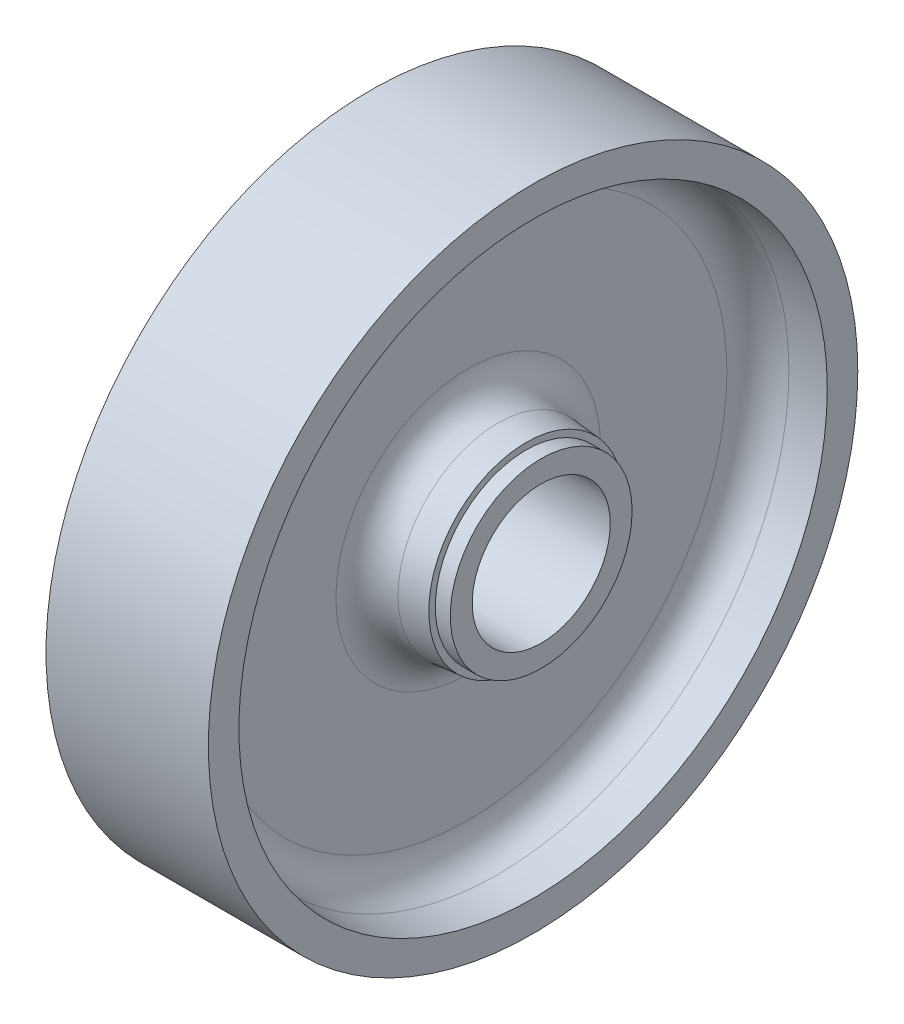
ISO-10303-21;
HEADER;
FILE_DESCRIPTION(('STEP AP214'),'2;1');
FILE_NAME('part.step','',(''),(''),'','','');
FILE_SCHEMA(('AUTOMOTIVE_DESIGN { 1 0 10303 214 1 1 1 1 }'));
ENDSEC;
DATA;
#1=APPLICATION_CONTEXT('core data for automotive mechanical design processes');
#2=APPLICATION_PROTOCOL_DEFINITION('international standard','automotive_design',2000,#1);
#3=PRODUCT_CONTEXT('',#1,'mechanical');
#4=PRODUCT('Part','Part','',(#3));
#5=PRODUCT_RELATED_PRODUCT_CATEGORY('part','',(#4));
#6=PRODUCT_DEFINITION_FORMATION('','',#4);
#7=PRODUCT_DEFINITION_CONTEXT('part definition',#1,'design');
#8=PRODUCT_DEFINITION('design','',#6,#7);
#9=PRODUCT_DEFINITION_SHAPE('','',#8);
#10=(LENGTH_UNIT() NAMED_UNIT(*) SI_UNIT(.MILLI.,.METRE.));
#11=(NAMED_UNIT(*) PLANE_ANGLE_UNIT() SI_UNIT($,.RADIAN.));
#12=(NAMED_UNIT(*) SI_UNIT($,.STERADIAN.) SOLID_ANGLE_UNIT());
#13=UNCERTAINTY_MEASURE_WITH_UNIT(LENGTH_MEASURE(1.E-05),#10,'distance_accuracy_value','');
#14=(GEOMETRIC_REPRESENTATION_CONTEXT(3) GLOBAL_UNCERTAINTY_ASSIGNED_CONTEXT((#13)) GLOBAL_UNIT_ASSIGNED_CONTEXT((#10,
#11,#12)) REPRESENTATION_CONTEXT('',''));
#15=CARTESIAN_POINT('',(0.,0.,0.));
#16=DIRECTION('',(0.,0.,1.));
#17=DIRECTION('',(1.,0.,0.));
#18=AXIS2_PLACEMENT_3D('',#15,#16,#17);
#19=CARTESIAN_POINT('',(-14.5288000000009,19.049999999999,0.));
#20=DIRECTION('',(-1.,0.,0.));
#21=DIRECTION('',(0.,0.,1.));
#22=AXIS2_PLACEMENT_3D('',#19,#20,#21);
#23=PLANE('',#22);
#24=CARTESIAN_POINT('',(-14.5288000000009,0.,0.));
#25=DIRECTION('',(1.,0.,0.));
#26=DIRECTION('',(0.,0.,-1.));
#27=AXIS2_PLACEMENT_3D('',#24,#25,#26);
#28=CIRCLE('',#27,17.779999999999);
#29=CARTESIAN_POINT('',(-14.5288000000009,0.,-17.779999999999));
#30=VERTEX_POINT('',#29);
#31=EDGE_CURVE('E100',#30,#30,#28,.T.);
#32=ORIENTED_EDGE('',*,*,#31,.T.);
#33=EDGE_LOOP('',(#32));
#34=FACE_BOUND('',#33,.T.);
#35=CARTESIAN_POINT('',(-14.5288000000009,0.,0.));
#36=DIRECTION('',(1.,0.,0.));
#37=DIRECTION('',(0.,0.,-1.));
#38=AXIS2_PLACEMENT_3D('',#35,#36,#37);
#39=CIRCLE('',#38,19.049999999999);
#40=CARTESIAN_POINT('',(-14.5288000000009,0.,-19.049999999999));
#41=VERTEX_POINT('',#40);
#42=EDGE_CURVE('E10',#41,#41,#39,.T.);
#43=ORIENTED_EDGE('',*,*,#42,.F.);
#44=EDGE_LOOP('',(#43));
#45=FACE_BOUND('',#44,.T.);
#46=ADVANCED_FACE('F36',(#34,#45),#23,.T.);
#47=CARTESIAN_POINT('',(-8.97156103355268,0.,0.));
#48=DIRECTION('',(1.,0.,0.));
#49=DIRECTION('',(0.,0.,-1.));
#50=AXIS2_PLACEMENT_3D('',#47,#48,#49);
#51=CONICAL_SURFACE('',#50,19.536195410068,0.0872664625997704);
#52=ORIENTED_EDGE('',*,*,#42,.T.);
#53=EDGE_LOOP('',(#52));
#54=FACE_BOUND('',#53,.T.);
#55=CARTESIAN_POINT('',(-8.97156103355268,0.,0.));
#56=DIRECTION('',(1.,0.,0.));
#57=DIRECTION('',(0.,0.,-1.));
#58=AXIS2_PLACEMENT_3D('',#55,#56,#57);
#59=CIRCLE('',#58,19.536195410068);
#60=CARTESIAN_POINT('',(-8.97156103355268,0.,-19.536195410068));
#61=VERTEX_POINT('',#60);
#62=EDGE_CURVE('E42',#61,#61,#59,.T.);
#63=ORIENTED_EDGE('',*,*,#62,.F.);
#64=EDGE_LOOP('',(#63));
#65=FACE_BOUND('',#64,.T.);
#66=ADVANCED_FACE('F118',(#54,#65),#51,.T.);
#67=CARTESIAN_POINT('',(-9.52500000000071,0.,0.));
#68=DIRECTION('',(1.,0.,0.));
#69=DIRECTION('',(0.,0.,-1.));
#70=AXIS2_PLACEMENT_3D('',#67,#68,#69);
#71=TOROIDAL_SURFACE('',#70,25.8620317429513,6.35000000000071);
#72=ORIENTED_EDGE('',*,*,#62,.T.);
#73=EDGE_LOOP('',(#72));
#74=FACE_BOUND('',#73,.T.);
#75=CARTESIAN_POINT('',(-3.175,0.,0.));
#76=DIRECTION('',(1.,0.,0.));
#77=DIRECTION('',(0.,0.,-1.));
#78=AXIS2_PLACEMENT_3D('',#75,#76,#77);
#79=CIRCLE('',#78,25.8620317429513);
#80=CARTESIAN_POINT('',(-3.175,0.,-25.8620317429513));
#81=VERTEX_POINT('',#80);
#82=EDGE_CURVE('E46',#81,#81,#79,.T.);
#83=ORIENTED_EDGE('',*,*,#82,.F.);
#84=EDGE_LOOP('',(#83));
#85=FACE_BOUND('',#84,.T.);
#86=ADVANCED_FACE('F122',(#74,#85),#71,.F.);
#87=CARTESIAN_POINT('',(-3.17500000000001,50.6011910182107,0.));
#88=DIRECTION('',(-1.,0.,0.));
#89=DIRECTION('',(0.,0.,1.));
#90=AXIS2_PLACEMENT_3D('',#87,#88,#89);
#91=PLANE('',#90);
#92=ORIENTED_EDGE('',*,*,#82,.T.);
#93=EDGE_LOOP('',(#92));
#94=FACE_BOUND('',#93,.T.);
#95=CARTESIAN_POINT('',(-3.17500000000001,0.,0.));
#96=DIRECTION('',(1.,0.,0.));
#97=DIRECTION('',(0.,0.,-1.));
#98=AXIS2_PLACEMENT_3D('',#95,#96,#97);
#99=CIRCLE('',#98,50.6011910182107);
#100=CARTESIAN_POINT('',(-3.17500000000001,0.,-50.6011910182107));
#101=VERTEX_POINT('',#100);
#102=EDGE_CURVE('E50',#101,#101,#99,.T.);
#103=ORIENTED_EDGE('',*,*,#102,.F.);
#104=EDGE_LOOP('',(#103));
#105=FACE_BOUND('',#104,.T.);
#106=ADVANCED_FACE('F126',(#94,#105),#91,.T.);
#107=CARTESIAN_POINT('',(-9.52499999999971,0.,0.));
#108=DIRECTION('',(1.,0.,0.));
#109=DIRECTION('',(0.,0.,-1.));
#110=AXIS2_PLACEMENT_3D('',#107,#108,#109);
#111=TOROIDAL_SURFACE('',#110,50.6011910182107,6.3499999999997);
#112=ORIENTED_EDGE('',*,*,#102,.T.);
#113=EDGE_LOOP('',(#112));
#114=FACE_BOUND('',#113,.T.);
#115=CARTESIAN_POINT('',(-8.9715610335524,0.,0.));
#116=DIRECTION('',(1.,0.,0.));
#117=DIRECTION('',(0.,0.,-1.));
#118=AXIS2_PLACEMENT_3D('',#115,#116,#117);
#119=CIRCLE('',#118,56.927027351093);
#120=CARTESIAN_POINT('',(-8.9715610335524,0.,-56.927027351093));
#121=VERTEX_POINT('',#120);
#122=EDGE_CURVE('E55',#121,#121,#119,.T.);
#123=ORIENTED_EDGE('',*,*,#122,.F.);
#124=EDGE_LOOP('',(#123));
#125=FACE_BOUND('',#124,.T.);
#126=ADVANCED_FACE('F132',(#114,#125),#111,.F.);
#127=CARTESIAN_POINT('',(-15.875,0.,0.));
#128=DIRECTION('',(-1.,0.,0.));
#129=DIRECTION('',(0.,0.,1.));
#130=AXIS2_PLACEMENT_3D('',#127,#128,#129);
#131=CONICAL_SURFACE('',#130,57.531,0.0872664625996731);
#132=ORIENTED_EDGE('',*,*,#122,.T.);
#133=EDGE_LOOP('',(#132));
#134=FACE_BOUND('',#133,.T.);
#135=CARTESIAN_POINT('',(-15.875,0.,0.));
#136=DIRECTION('',(1.,0.,0.));
#137=DIRECTION('',(0.,0.,-1.));
#138=AXIS2_PLACEMENT_3D('',#135,#136,#137);
#139=CIRCLE('',#138,57.531);
#140=CARTESIAN_POINT('',(-15.875,0.,-57.531));
#141=VERTEX_POINT('',#140);
#142=EDGE_CURVE('E58',#141,#141,#139,.T.);
#143=ORIENTED_EDGE('',*,*,#142,.F.);
#144=EDGE_LOOP('',(#143));
#145=FACE_BOUND('',#144,.T.);
#146=ADVANCED_FACE('F136',(#134,#145),#131,.F.);
#147=CARTESIAN_POINT('',(-15.875,63.5,0.));
#148=DIRECTION('',(-1.,0.,0.));
#149=DIRECTION('',(0.,0.,1.));
#150=AXIS2_PLACEMENT_3D('',#147,#148,#149);
#151=PLANE('',#150);
#152=ORIENTED_EDGE('',*,*,#142,.T.);
#153=EDGE_LOOP('',(#152));
#154=FACE_BOUND('',#153,.T.);
#155=CARTESIAN_POINT('',(-15.875,0.,0.));
#156=DIRECTION('',(1.,0.,0.));
#157=DIRECTION('',(0.,0.,-1.));
#158=AXIS2_PLACEMENT_3D('',#155,#156,#157);
#159=CIRCLE('',#158,63.5);
#160=CARTESIAN_POINT('',(-15.875,0.,-63.5));
#161=VERTEX_POINT('',#160);
#162=EDGE_CURVE('E61',#161,#161,#159,.T.);
#163=ORIENTED_EDGE('',*,*,#162,.F.);
#164=EDGE_LOOP('',(#163));
#165=FACE_BOUND('',#164,.T.);
#166=ADVANCED_FACE('F140',(#154,#165),#151,.T.);
#167=CARTESIAN_POINT('',(-17.4625,0.,0.));
#168=DIRECTION('',(1.,0.,0.));
#169=DIRECTION('',(0.,0.,-1.));
#170=AXIS2_PLACEMENT_3D('',#167,#168,#169);
#171=CYLINDRICAL_SURFACE('',#170,63.5);
#172=ORIENTED_EDGE('',*,*,#162,.T.);
#173=EDGE_LOOP('',(#172));
#174=FACE_BOUND('',#173,.T.);
#175=CARTESIAN_POINT('',(15.8750000000026,0.,0.));
#176=DIRECTION('',(1.,0.,0.));
#177=DIRECTION('',(0.,0.,-1.));
#178=AXIS2_PLACEMENT_3D('',#175,#176,#177);
#179=CIRCLE('',#178,63.5);
#180=CARTESIAN_POINT('',(15.8750000000026,0.,-63.5));
#181=VERTEX_POINT('',#180);
#182=EDGE_CURVE('E64',#181,#181,#179,.T.);
#183=ORIENTED_EDGE('',*,*,#182,.F.);
#184=EDGE_LOOP('',(#183));
#185=FACE_BOUND('',#184,.T.);
#186=ADVANCED_FACE('F144',(#174,#185),#171,.T.);
#187=CARTESIAN_POINT('',(15.8750000000026,57.5310000000028,0.));
#188=DIRECTION('',(1.,0.,0.));
#189=DIRECTION('',(0.,0.,-1.));
#190=AXIS2_PLACEMENT_3D('',#187,#188,#189);
#191=PLANE('',#190);
#192=ORIENTED_EDGE('',*,*,#182,.T.);
#193=EDGE_LOOP('',(#192));
#194=FACE_BOUND('',#193,.T.);
#195=CARTESIAN_POINT('',(15.8750000000026,0.,0.));
#196=DIRECTION('',(1.,0.,0.));
#197=DIRECTION('',(0.,0.,-1.));
#198=AXIS2_PLACEMENT_3D('',#195,#196,#197);
#199=CIRCLE('',#198,57.5310000000028);
#200=CARTESIAN_POINT('',(15.8750000000026,0.,-57.5310000000028));
#201=VERTEX_POINT('',#200);
#202=EDGE_CURVE('E67',#201,#201,#199,.T.);
#203=ORIENTED_EDGE('',*,*,#202,.F.);
#204=EDGE_LOOP('',(#203));
#205=FACE_BOUND('',#204,.T.);
#206=ADVANCED_FACE('F148',(#194,#205),#191,.T.);
#207=CARTESIAN_POINT('',(8.97156103355497,0.,0.));
#208=DIRECTION('',(1.,0.,0.));
#209=DIRECTION('',(0.,0.,-1.));
#210=AXIS2_PLACEMENT_3D('',#207,#208,#209);
#211=CONICAL_SURFACE('',#210,56.9270273510959,0.0872664625996738);
#212=ORIENTED_EDGE('',*,*,#202,.T.);
#213=EDGE_LOOP('',(#212));
#214=FACE_BOUND('',#213,.T.);
#215=CARTESIAN_POINT('',(8.97156103355497,0.,0.));
#216=DIRECTION('',(1.,0.,0.));
#217=DIRECTION('',(0.,0.,-1.));
#218=AXIS2_PLACEMENT_3D('',#215,#216,#217);
#219=CIRCLE('',#218,56.9270273510959);
#220=CARTESIAN_POINT('',(8.97156103355497,0.,-56.9270273510959));
#221=VERTEX_POINT('',#220);
#222=EDGE_CURVE('E70',#221,#221,#219,.T.);
#223=ORIENTED_EDGE('',*,*,#222,.F.);
#224=EDGE_LOOP('',(#223));
#225=FACE_BOUND('',#224,.T.);
#226=ADVANCED_FACE('F152',(#214,#225),#211,.F.);
#227=CARTESIAN_POINT('',(9.52500000000264,0.,0.));
#228=DIRECTION('',(1.,0.,0.));
#229=DIRECTION('',(0.,0.,-1.));
#230=AXIS2_PLACEMENT_3D('',#227,#228,#229);
#231=TOROIDAL_SURFACE('',#230,50.6011910182097,6.35000000000357);
#232=ORIENTED_EDGE('',*,*,#222,.T.);
#233=EDGE_LOOP('',(#232));
#234=FACE_BOUND('',#233,.T.);
#235=CARTESIAN_POINT('',(3.17499999999908,0.,0.));
#236=DIRECTION('',(1.,0.,0.));
#237=DIRECTION('',(0.,0.,-1.));
#238=AXIS2_PLACEMENT_3D('',#235,#236,#237);
#239=CIRCLE('',#238,50.6011910182097);
#240=CARTESIAN_POINT('',(3.17499999999908,0.,-50.6011910182097));
#241=VERTEX_POINT('',#240);
#242=EDGE_CURVE('E73',#241,#241,#239,.T.);
#243=ORIENTED_EDGE('',*,*,#242,.F.);
#244=EDGE_LOOP('',(#243));
#245=FACE_BOUND('',#244,.T.);
#246=ADVANCED_FACE('F156',(#234,#245),#231,.F.);
#247=CARTESIAN_POINT('',(3.17499999999908,25.8620317429503,0.));
#248=DIRECTION('',(1.,0.,0.));
#249=DIRECTION('',(0.,0.,-1.));
#250=AXIS2_PLACEMENT_3D('',#247,#248,#249);
#251=PLANE('',#250);
#252=ORIENTED_EDGE('',*,*,#242,.T.);
#253=EDGE_LOOP('',(#252));
#254=FACE_BOUND('',#253,.T.);
#255=CARTESIAN_POINT('',(3.17499999999908,0.,0.));
#256=DIRECTION('',(1.,0.,0.));
#257=DIRECTION('',(0.,0.,-1.));
#258=AXIS2_PLACEMENT_3D('',#255,#256,#257);
#259=CIRCLE('',#258,25.8620317429503);
#260=CARTESIAN_POINT('',(3.17499999999908,0.,-25.8620317429503));
#261=VERTEX_POINT('',#260);
#262=EDGE_CURVE('E76',#261,#261,#259,.T.);
#263=ORIENTED_EDGE('',*,*,#262,.F.);
#264=EDGE_LOOP('',(#263));
#265=FACE_BOUND('',#264,.T.);
#266=ADVANCED_FACE('F160',(#254,#265),#251,.T.);
#267=CARTESIAN_POINT('',(9.52499999999878,0.,0.));
#268=DIRECTION('',(1.,0.,0.));
#269=DIRECTION('',(0.,0.,-1.));
#270=AXIS2_PLACEMENT_3D('',#267,#268,#269);
#271=TOROIDAL_SURFACE('',#270,25.8620317429503,6.3499999999997);
#272=ORIENTED_EDGE('',*,*,#262,.T.);
#273=EDGE_LOOP('',(#272));
#274=FACE_BOUND('',#273,.T.);
#275=CARTESIAN_POINT('',(8.97156103355083,0.,0.));
#276=DIRECTION('',(1.,0.,0.));
#277=DIRECTION('',(0.,0.,-1.));
#278=AXIS2_PLACEMENT_3D('',#275,#276,#277);
#279=CIRCLE('',#278,19.536195410068);
#280=CARTESIAN_POINT('',(8.97156103355083,0.,-19.536195410068));
#281=VERTEX_POINT('',#280);
#282=EDGE_CURVE('E79',#281,#281,#279,.T.);
#283=ORIENTED_EDGE('',*,*,#282,.F.);
#284=EDGE_LOOP('',(#283));
#285=FACE_BOUND('',#284,.T.);
#286=ADVANCED_FACE('F164',(#274,#285),#271,.F.);
#287=CARTESIAN_POINT('',(14.5287999999991,0.,0.));
#288=DIRECTION('',(-1.,0.,0.));
#289=DIRECTION('',(0.,0.,1.));
#290=AXIS2_PLACEMENT_3D('',#287,#288,#289);
#291=CONICAL_SURFACE('',#290,19.049999999999,0.087266462599771);
#292=ORIENTED_EDGE('',*,*,#282,.T.);
#293=EDGE_LOOP('',(#292));
#294=FACE_BOUND('',#293,.T.);
#295=CARTESIAN_POINT('',(14.5287999999991,0.,0.));
#296=DIRECTION('',(1.,0.,0.));
#297=DIRECTION('',(0.,0.,-1.));
#298=AXIS2_PLACEMENT_3D('',#295,#296,#297);
#299=CIRCLE('',#298,19.049999999999);
#300=CARTESIAN_POINT('',(14.5287999999991,0.,-19.049999999999));
#301=VERTEX_POINT('',#300);
#302=EDGE_CURVE('E82',#301,#301,#299,.T.);
#303=ORIENTED_EDGE('',*,*,#302,.F.);
#304=EDGE_LOOP('',(#303));
#305=FACE_BOUND('',#304,.T.);
#306=ADVANCED_FACE('F168',(#294,#305),#291,.T.);
#307=CARTESIAN_POINT('',(14.5287999999991,17.779999999999,0.));
#308=DIRECTION('',(1.,0.,0.));
#309=DIRECTION('',(0.,0.,-1.));
#310=AXIS2_PLACEMENT_3D('',#307,#308,#309);
#311=PLANE('',#310);
#312=ORIENTED_EDGE('',*,*,#302,.T.);
#313=EDGE_LOOP('',(#312));
#314=FACE_BOUND('',#313,.T.);
#315=CARTESIAN_POINT('',(14.5287999999991,0.,0.));
#316=DIRECTION('',(1.,0.,0.));
#317=DIRECTION('',(0.,0.,-1.));
#318=AXIS2_PLACEMENT_3D('',#315,#316,#317);
#319=CIRCLE('',#318,17.779999999999);
#320=CARTESIAN_POINT('',(14.5287999999991,0.,-17.779999999999));
#321=VERTEX_POINT('',#320);
#322=EDGE_CURVE('E85',#321,#321,#319,.T.);
#323=ORIENTED_EDGE('',*,*,#322,.F.);
#324=EDGE_LOOP('',(#323));
#325=FACE_BOUND('',#324,.T.);
#326=ADVANCED_FACE('F172',(#314,#325),#311,.T.);
#327=CARTESIAN_POINT('',(-17.4625,0.,0.));
#328=DIRECTION('',(1.,0.,0.));
#329=DIRECTION('',(0.,0.,-1.));
#330=AXIS2_PLACEMENT_3D('',#327,#328,#329);
#331=CYLINDRICAL_SURFACE('',#330,17.779999999999);
#332=ORIENTED_EDGE('',*,*,#322,.T.);
#333=EDGE_LOOP('',(#332));
#334=FACE_BOUND('',#333,.T.);
#335=CARTESIAN_POINT('',(17.4624999999991,0.,0.));
#336=DIRECTION('',(1.,0.,0.));
#337=DIRECTION('',(0.,0.,-1.));
#338=AXIS2_PLACEMENT_3D('',#335,#336,#337);
#339=CIRCLE('',#338,17.779999999999);
#340=CARTESIAN_POINT('',(17.4624999999991,0.,-17.779999999999));
#341=VERTEX_POINT('',#340);
#342=EDGE_CURVE('E88',#341,#341,#339,.T.);
#343=ORIENTED_EDGE('',*,*,#342,.F.);
#344=EDGE_LOOP('',(#343));
#345=FACE_BOUND('',#344,.T.);
#346=ADVANCED_FACE('F176',(#334,#345),#331,.T.);
#347=CARTESIAN_POINT('',(17.4624999999991,13.500099999999,0.));
#348=DIRECTION('',(1.,0.,0.));
#349=DIRECTION('',(0.,0.,-1.));
#350=AXIS2_PLACEMENT_3D('',#347,#348,#349);
#351=PLANE('',#350);
#352=ORIENTED_EDGE('',*,*,#342,.T.);
#353=EDGE_LOOP('',(#352));
#354=FACE_BOUND('',#353,.T.);
#355=CARTESIAN_POINT('',(17.4624999999991,0.,0.));
#356=DIRECTION('',(1.,0.,0.));
#357=DIRECTION('',(0.,0.,-1.));
#358=AXIS2_PLACEMENT_3D('',#355,#356,#357);
#359=CIRCLE('',#358,13.500099999999);
#360=CARTESIAN_POINT('',(17.4624999999991,0.,-13.500099999999));
#361=VERTEX_POINT('',#360);
#362=EDGE_CURVE('E91',#361,#361,#359,.T.);
#363=ORIENTED_EDGE('',*,*,#362,.F.);
#364=EDGE_LOOP('',(#363));
#365=FACE_BOUND('',#364,.T.);
#366=ADVANCED_FACE('F180',(#354,#365),#351,.T.);
#367=CARTESIAN_POINT('',(-17.4625,0.,0.));
#368=DIRECTION('',(1.,0.,0.));
#369=DIRECTION('',(0.,0.,-1.));
#370=AXIS2_PLACEMENT_3D('',#367,#368,#369);
#371=CYLINDRICAL_SURFACE('',#370,13.500099999999);
#372=ORIENTED_EDGE('',*,*,#362,.T.);
#373=EDGE_LOOP('',(#372));
#374=FACE_BOUND('',#373,.T.);
#375=CARTESIAN_POINT('',(-17.4625000000009,0.,0.));
#376=DIRECTION('',(1.,0.,0.));
#377=DIRECTION('',(0.,0.,-1.));
#378=AXIS2_PLACEMENT_3D('',#375,#376,#377);
#379=CIRCLE('',#378,13.500099999999);
#380=CARTESIAN_POINT('',(-17.4625000000009,0.,-13.500099999999));
#381=VERTEX_POINT('',#380);
#382=EDGE_CURVE('E94',#381,#381,#379,.T.);
#383=ORIENTED_EDGE('',*,*,#382,.F.);
#384=EDGE_LOOP('',(#383));
#385=FACE_BOUND('',#384,.T.);
#386=ADVANCED_FACE('F114',(#374,#385),#371,.F.);
#387=CARTESIAN_POINT('',(-17.4625000000009,17.779999999999,0.));
#388=DIRECTION('',(-1.,0.,0.));
#389=DIRECTION('',(0.,0.,1.));
#390=AXIS2_PLACEMENT_3D('',#387,#388,#389);
#391=PLANE('',#390);
#392=ORIENTED_EDGE('',*,*,#382,.T.);
#393=EDGE_LOOP('',(#392));
#394=FACE_BOUND('',#393,.T.);
#395=CARTESIAN_POINT('',(-17.4625000000009,0.,0.));
#396=DIRECTION('',(1.,0.,0.));
#397=DIRECTION('',(0.,0.,-1.));
#398=AXIS2_PLACEMENT_3D('',#395,#396,#397);
#399=CIRCLE('',#398,17.779999999999);
#400=CARTESIAN_POINT('',(-17.4625000000009,0.,-17.779999999999));
#401=VERTEX_POINT('',#400);
#402=EDGE_CURVE('E97',#401,#401,#399,.T.);
#403=ORIENTED_EDGE('',*,*,#402,.F.);
#404=EDGE_LOOP('',(#403));
#405=FACE_BOUND('',#404,.T.);
#406=ADVANCED_FACE('F108',(#394,#405),#391,.T.);
#407=CARTESIAN_POINT('',(-17.4625,0.,0.));
#408=DIRECTION('',(1.,0.,0.));
#409=DIRECTION('',(0.,0.,-1.));
#410=AXIS2_PLACEMENT_3D('',#407,#408,#409);
#411=CYLINDRICAL_SURFACE('',#410,17.779999999999);
#412=ORIENTED_EDGE('',*,*,#402,.T.);
#413=EDGE_LOOP('',(#412));
#414=FACE_BOUND('',#413,.T.);
#415=ORIENTED_EDGE('',*,*,#31,.F.);
#416=EDGE_LOOP('',(#415));
#417=FACE_BOUND('',#416,.T.);
#418=ADVANCED_FACE('F106',(#414,#417),#411,.T.);
#419=CLOSED_SHELL('',(#46,#66,#86,#106,#126,#146,#166,#186,#206,#226,#246,#266,#286,#306,#326,
#346,#366,#386,#406,#418));
#420=MANIFOLD_SOLID_BREP('B2',#419);
#421=ADVANCED_BREP_SHAPE_REPRESENTATION('',(#18,#420),#14);
#422=SHAPE_DEFINITION_REPRESENTATION(#9,#421);
ENDSEC;
END-ISO-10303-21;
